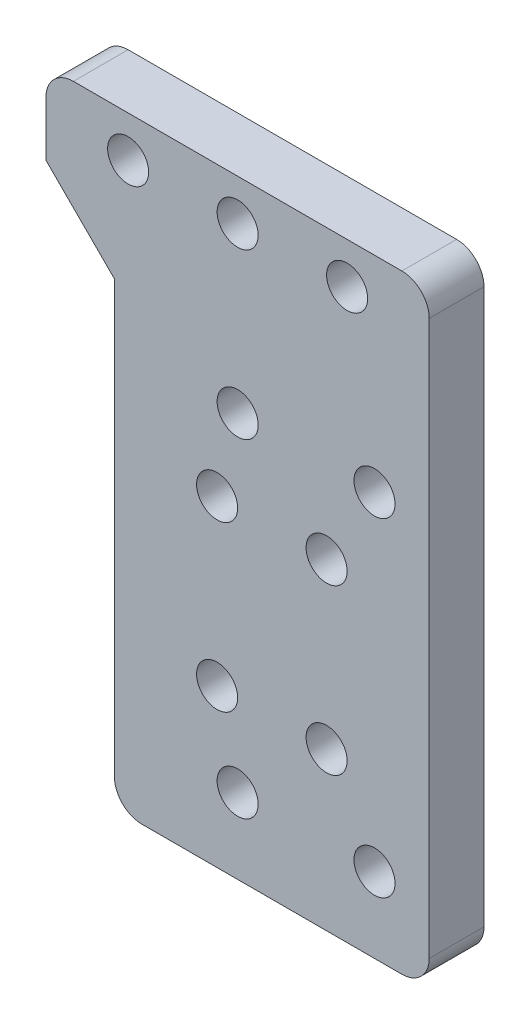
ISO-10303-21;
HEADER;
FILE_DESCRIPTION(('STEP AP214'),'2;1');
FILE_NAME('part.step','',(''),(''),'','','');
FILE_SCHEMA(('AUTOMOTIVE_DESIGN { 1 0 10303 214 1 1 1 1 }'));
ENDSEC;
DATA;
#1=APPLICATION_CONTEXT('core data for automotive mechanical design processes');
#2=APPLICATION_PROTOCOL_DEFINITION('international standard','automotive_design',2000,#1);
#3=PRODUCT_CONTEXT('',#1,'mechanical');
#4=PRODUCT('Part','Part','',(#3));
#5=PRODUCT_RELATED_PRODUCT_CATEGORY('part','',(#4));
#6=PRODUCT_DEFINITION_FORMATION('','',#4);
#7=PRODUCT_DEFINITION_CONTEXT('part definition',#1,'design');
#8=PRODUCT_DEFINITION('design','',#6,#7);
#9=PRODUCT_DEFINITION_SHAPE('','',#8);
#10=(LENGTH_UNIT() NAMED_UNIT(*) SI_UNIT(.MILLI.,.METRE.));
#11=(NAMED_UNIT(*) PLANE_ANGLE_UNIT() SI_UNIT($,.RADIAN.));
#12=(NAMED_UNIT(*) SI_UNIT($,.STERADIAN.) SOLID_ANGLE_UNIT());
#13=UNCERTAINTY_MEASURE_WITH_UNIT(LENGTH_MEASURE(1.E-05),#10,'distance_accuracy_value','');
#14=(GEOMETRIC_REPRESENTATION_CONTEXT(3) GLOBAL_UNCERTAINTY_ASSIGNED_CONTEXT((#13)) GLOBAL_UNIT_ASSIGNED_CONTEXT((#10,
#11,#12)) REPRESENTATION_CONTEXT('',''));
#15=CARTESIAN_POINT('',(0.,0.,0.));
#16=DIRECTION('',(0.,0.,1.));
#17=DIRECTION('',(1.,0.,0.));
#18=AXIS2_PLACEMENT_3D('',#15,#16,#17);
#19=CARTESIAN_POINT('',(0.,0.,4.));
#20=DIRECTION('',(0.,0.,-1.));
#21=DIRECTION('',(-1.,0.,0.));
#22=AXIS2_PLACEMENT_3D('',#19,#20,#21);
#23=PLANE('',#22);
#24=DIRECTION('',(0.,-1.,0.));
#25=VECTOR('',#24,1.);
#26=CARTESIAN_POINT('',(-9.00000000000005,11.2499999999999,4.));
#27=LINE('',#26,#25);
#28=CARTESIAN_POINT('',(-9.00000000000005,11.2499999999999,4.));
#29=VERTEX_POINT('',#28);
#30=CARTESIAN_POINT('',(-9.00000000000005,-20.25,4.));
#31=VERTEX_POINT('',#30);
#32=EDGE_CURVE('E138',#29,#31,#27,.T.);
#33=ORIENTED_EDGE('',*,*,#32,.T.);
#34=CARTESIAN_POINT('',(-7.00000000000005,-20.25,4.));
#35=DIRECTION('',(0.,0.,-1.));
#36=DIRECTION('',(-1.,0.,0.));
#37=AXIS2_PLACEMENT_3D('',#34,#35,#36);
#38=CIRCLE('',#37,2.);
#39=CARTESIAN_POINT('',(-7.00000000000005,-22.25,4.));
#40=VERTEX_POINT('',#39);
#41=EDGE_CURVE('E181',#31,#40,#38,.F.);
#42=ORIENTED_EDGE('',*,*,#41,.T.);
#43=DIRECTION('',(1.,0.,0.));
#44=VECTOR('',#43,1.);
#45=CARTESIAN_POINT('',(-9.00000000000005,-22.25,4.));
#46=LINE('',#45,#44);
#47=CARTESIAN_POINT('',(12.0000000000002,-22.25,4.));
#48=VERTEX_POINT('',#47);
#49=EDGE_CURVE('E143',#40,#48,#46,.T.);
#50=ORIENTED_EDGE('',*,*,#49,.T.);
#51=CARTESIAN_POINT('',(12.0000000000002,-20.25,4.));
#52=DIRECTION('',(0.,0.,-1.));
#53=DIRECTION('',(-1.,0.,0.));
#54=AXIS2_PLACEMENT_3D('',#51,#52,#53);
#55=CIRCLE('',#54,2.);
#56=CARTESIAN_POINT('',(14.0000000000002,-20.25,4.));
#57=VERTEX_POINT('',#56);
#58=EDGE_CURVE('E182',#48,#57,#55,.F.);
#59=ORIENTED_EDGE('',*,*,#58,.T.);
#60=DIRECTION('',(0.,1.,0.));
#61=VECTOR('',#60,1.);
#62=CARTESIAN_POINT('',(14.0000000000002,-22.25,4.));
#63=LINE('',#62,#61);
#64=CARTESIAN_POINT('',(14.0000000000002,20.25,4.));
#65=VERTEX_POINT('',#64);
#66=EDGE_CURVE('E165',#57,#65,#63,.T.);
#67=ORIENTED_EDGE('',*,*,#66,.T.);
#68=CARTESIAN_POINT('',(12.0000000000002,20.25,4.));
#69=DIRECTION('',(0.,0.,-1.));
#70=DIRECTION('',(-1.,0.,0.));
#71=AXIS2_PLACEMENT_3D('',#68,#69,#70);
#72=CIRCLE('',#71,2.);
#73=CARTESIAN_POINT('',(12.0000000000002,22.25,4.));
#74=VERTEX_POINT('',#73);
#75=EDGE_CURVE('E178',#65,#74,#72,.F.);
#76=ORIENTED_EDGE('',*,*,#75,.T.);
#77=DIRECTION('',(-1.,0.,0.));
#78=VECTOR('',#77,1.);
#79=CARTESIAN_POINT('',(-14.0000000000002,22.25,4.));
#80=LINE('',#79,#78);
#81=CARTESIAN_POINT('',(-12.0000000000002,22.25,4.));
#82=VERTEX_POINT('',#81);
#83=EDGE_CURVE('E123',#74,#82,#80,.T.);
#84=ORIENTED_EDGE('',*,*,#83,.T.);
#85=CARTESIAN_POINT('',(-12.0000000000002,20.25,4.));
#86=DIRECTION('',(0.,0.,-1.));
#87=DIRECTION('',(-1.,0.,0.));
#88=AXIS2_PLACEMENT_3D('',#85,#86,#87);
#89=CIRCLE('',#88,2.);
#90=CARTESIAN_POINT('',(-14.0000000000002,20.25,4.));
#91=VERTEX_POINT('',#90);
#92=EDGE_CURVE('E53',#82,#91,#89,.F.);
#93=ORIENTED_EDGE('',*,*,#92,.T.);
#94=DIRECTION('',(0.,-1.,0.));
#95=VECTOR('',#94,1.);
#96=CARTESIAN_POINT('',(-14.0000000000002,22.25,4.));
#97=LINE('',#96,#95);
#98=CARTESIAN_POINT('',(-14.0000000000002,16.25,4.));
#99=VERTEX_POINT('',#98);
#100=EDGE_CURVE('E113',#91,#99,#97,.T.);
#101=ORIENTED_EDGE('',*,*,#100,.T.);
#102=DIRECTION('',(0.707106781186554,-0.707106781186541,0.));
#103=VECTOR('',#102,1.);
#104=CARTESIAN_POINT('',(-14.0000000000002,16.25,4.));
#105=LINE('',#104,#103);
#106=EDGE_CURVE('E120',#99,#29,#105,.T.);
#107=ORIENTED_EDGE('',*,*,#106,.T.);
#108=EDGE_LOOP('',(#33,#42,#50,#59,#67,#76,#84,#93,#101,#107));
#109=FACE_BOUND('',#108,.T.);
#110=CARTESIAN_POINT('',(-1.4999999999998,1.25,4.));
#111=DIRECTION('',(0.,0.,1.));
#112=DIRECTION('',(1.,0.,0.));
#113=AXIS2_PLACEMENT_3D('',#110,#111,#112);
#114=CIRCLE('',#113,1.5);
#115=CARTESIAN_POINT('',(2.01878444516801E-13,1.25,4.));
#116=VERTEX_POINT('',#115);
#117=EDGE_CURVE('E151',#116,#116,#114,.T.);
#118=ORIENTED_EDGE('',*,*,#117,.F.);
#119=EDGE_LOOP('',(#118));
#120=FACE_BOUND('',#119,.T.);
#121=CARTESIAN_POINT('',(6.5000000000002,1.25,4.));
#122=DIRECTION('',(0.,0.,1.));
#123=DIRECTION('',(1.,0.,0.));
#124=AXIS2_PLACEMENT_3D('',#121,#122,#123);
#125=CIRCLE('',#124,1.5);
#126=CARTESIAN_POINT('',(8.0000000000002,1.25,4.));
#127=VERTEX_POINT('',#126);
#128=EDGE_CURVE('E259',#127,#127,#125,.T.);
#129=ORIENTED_EDGE('',*,*,#128,.F.);
#130=EDGE_LOOP('',(#129));
#131=FACE_BOUND('',#130,.T.);
#132=CARTESIAN_POINT('',(-1.49999999999967,-10.75,4.));
#133=DIRECTION('',(0.,0.,1.));
#134=DIRECTION('',(1.,0.,0.));
#135=AXIS2_PLACEMENT_3D('',#132,#133,#134);
#136=CIRCLE('',#135,1.5);
#137=CARTESIAN_POINT('',(3.26561694352634E-13,-10.75,4.));
#138=VERTEX_POINT('',#137);
#139=EDGE_CURVE('E264',#138,#138,#136,.T.);
#140=ORIENTED_EDGE('',*,*,#139,.F.);
#141=EDGE_LOOP('',(#140));
#142=FACE_BOUND('',#141,.T.);
#143=CARTESIAN_POINT('',(6.50000000000033,-10.75,4.));
#144=DIRECTION('',(0.,0.,1.));
#145=DIRECTION('',(1.,0.,0.));
#146=AXIS2_PLACEMENT_3D('',#143,#144,#145);
#147=CIRCLE('',#146,1.5);
#148=CARTESIAN_POINT('',(8.00000000000033,-10.75,4.));
#149=VERTEX_POINT('',#148);
#150=EDGE_CURVE('E271',#149,#149,#147,.T.);
#151=ORIENTED_EDGE('',*,*,#150,.F.);
#152=EDGE_LOOP('',(#151));
#153=FACE_BOUND('',#152,.T.);
#154=CARTESIAN_POINT('',(2.0122792321331E-13,7.25000000000003,4.));
#155=DIRECTION('',(0.,0.,1.));
#156=DIRECTION('',(1.,0.,0.));
#157=AXIS2_PLACEMENT_3D('',#154,#155,#156);
#158=CIRCLE('',#157,1.5);
#159=CARTESIAN_POINT('',(1.5000000000002,7.25000000000003,4.));
#160=VERTEX_POINT('',#159);
#161=EDGE_CURVE('E280',#160,#160,#158,.T.);
#162=ORIENTED_EDGE('',*,*,#161,.F.);
#163=EDGE_LOOP('',(#162));
#164=FACE_BOUND('',#163,.T.);
#165=CARTESIAN_POINT('',(10.0000000000002,7.24999999999992,4.));
#166=DIRECTION('',(0.,0.,1.));
#167=DIRECTION('',(1.,0.,0.));
#168=AXIS2_PLACEMENT_3D('',#165,#166,#167);
#169=CIRCLE('',#168,1.5);
#170=CARTESIAN_POINT('',(11.5000000000002,7.24999999999992,4.));
#171=VERTEX_POINT('',#170);
#172=EDGE_CURVE('E284',#171,#171,#169,.T.);
#173=ORIENTED_EDGE('',*,*,#172,.F.);
#174=EDGE_LOOP('',(#173));
#175=FACE_BOUND('',#174,.T.);
#176=CARTESIAN_POINT('',(2.02962646689286E-13,-16.75,4.));
#177=DIRECTION('',(0.,0.,1.));
#178=DIRECTION('',(1.,0.,0.));
#179=AXIS2_PLACEMENT_3D('',#176,#177,#178);
#180=CIRCLE('',#179,1.5);
#181=CARTESIAN_POINT('',(1.5000000000002,-16.75,4.));
#182=VERTEX_POINT('',#181);
#183=EDGE_CURVE('E288',#182,#182,#180,.T.);
#184=ORIENTED_EDGE('',*,*,#183,.F.);
#185=EDGE_LOOP('',(#184));
#186=FACE_BOUND('',#185,.T.);
#187=CARTESIAN_POINT('',(10.0000000000002,-16.7500000000001,4.));
#188=DIRECTION('',(0.,0.,1.));
#189=DIRECTION('',(1.,0.,0.));
#190=AXIS2_PLACEMENT_3D('',#187,#188,#189);
#191=CIRCLE('',#190,1.5);
#192=CARTESIAN_POINT('',(11.5000000000002,-16.7500000000001,4.));
#193=VERTEX_POINT('',#192);
#194=EDGE_CURVE('E293',#193,#193,#191,.T.);
#195=ORIENTED_EDGE('',*,*,#194,.F.);
#196=EDGE_LOOP('',(#195));
#197=FACE_BOUND('',#196,.T.);
#198=CARTESIAN_POINT('',(8.0000000000002,19.25,4.));
#199=DIRECTION('',(0.,0.,1.));
#200=DIRECTION('',(1.,0.,0.));
#201=AXIS2_PLACEMENT_3D('',#198,#199,#200);
#202=CIRCLE('',#201,1.5);
#203=CARTESIAN_POINT('',(9.5000000000002,19.25,4.));
#204=VERTEX_POINT('',#203);
#205=EDGE_CURVE('E301',#204,#204,#202,.T.);
#206=ORIENTED_EDGE('',*,*,#205,.F.);
#207=EDGE_LOOP('',(#206));
#208=FACE_BOUND('',#207,.T.);
#209=CARTESIAN_POINT('',(1.99493199737333E-13,19.2499999999999,4.));
#210=DIRECTION('',(0.,0.,1.));
#211=DIRECTION('',(1.,0.,0.));
#212=AXIS2_PLACEMENT_3D('',#209,#210,#211);
#213=CIRCLE('',#212,1.5);
#214=CARTESIAN_POINT('',(1.5000000000002,19.2499999999999,4.));
#215=VERTEX_POINT('',#214);
#216=EDGE_CURVE('E307',#215,#215,#213,.T.);
#217=ORIENTED_EDGE('',*,*,#216,.F.);
#218=EDGE_LOOP('',(#217));
#219=FACE_BOUND('',#218,.T.);
#220=CARTESIAN_POINT('',(-7.9999999999998,19.2499999999999,4.));
#221=DIRECTION('',(0.,0.,1.));
#222=DIRECTION('',(1.,0.,0.));
#223=AXIS2_PLACEMENT_3D('',#220,#221,#222);
#224=CIRCLE('',#223,1.5);
#225=CARTESIAN_POINT('',(-6.4999999999998,19.2499999999999,4.));
#226=VERTEX_POINT('',#225);
#227=EDGE_CURVE('E311',#226,#226,#224,.T.);
#228=ORIENTED_EDGE('',*,*,#227,.F.);
#229=EDGE_LOOP('',(#228));
#230=FACE_BOUND('',#229,.T.);
#231=ADVANCED_FACE('F39',(#109,#120,#131,#142,#153,#164,#175,#186,#197,#208,#219,#230),#23,.F.);
#232=CARTESIAN_POINT('',(0.,0.,0.));
#233=DIRECTION('',(0.,0.,-1.));
#234=DIRECTION('',(-1.,0.,0.));
#235=AXIS2_PLACEMENT_3D('',#232,#233,#234);
#236=PLANE('',#235);
#237=CARTESIAN_POINT('',(1.99493199737333E-13,19.2499999999999,0.));
#238=DIRECTION('',(0.,0.,1.));
#239=DIRECTION('',(1.,0.,0.));
#240=AXIS2_PLACEMENT_3D('',#237,#238,#239);
#241=CIRCLE('',#240,1.5);
#242=CARTESIAN_POINT('',(1.5000000000002,19.2499999999999,0.));
#243=VERTEX_POINT('',#242);
#244=EDGE_CURVE('E309',#243,#243,#241,.T.);
#245=ORIENTED_EDGE('',*,*,#244,.T.);
#246=EDGE_LOOP('',(#245));
#247=FACE_BOUND('',#246,.T.);
#248=CARTESIAN_POINT('',(10.0000000000002,-16.7500000000001,0.));
#249=DIRECTION('',(0.,0.,1.));
#250=DIRECTION('',(1.,0.,0.));
#251=AXIS2_PLACEMENT_3D('',#248,#249,#250);
#252=CIRCLE('',#251,1.5);
#253=CARTESIAN_POINT('',(11.5000000000002,-16.7500000000001,0.));
#254=VERTEX_POINT('',#253);
#255=EDGE_CURVE('E299',#254,#254,#252,.T.);
#256=ORIENTED_EDGE('',*,*,#255,.T.);
#257=EDGE_LOOP('',(#256));
#258=FACE_BOUND('',#257,.T.);
#259=CARTESIAN_POINT('',(10.0000000000002,7.24999999999992,0.));
#260=DIRECTION('',(0.,0.,1.));
#261=DIRECTION('',(1.,0.,0.));
#262=AXIS2_PLACEMENT_3D('',#259,#260,#261);
#263=CIRCLE('',#262,1.5);
#264=CARTESIAN_POINT('',(11.5000000000002,7.24999999999992,0.));
#265=VERTEX_POINT('',#264);
#266=EDGE_CURVE('E286',#265,#265,#263,.T.);
#267=ORIENTED_EDGE('',*,*,#266,.T.);
#268=EDGE_LOOP('',(#267));
#269=FACE_BOUND('',#268,.T.);
#270=CARTESIAN_POINT('',(6.50000000000033,-10.75,0.));
#271=DIRECTION('',(0.,0.,1.));
#272=DIRECTION('',(1.,0.,0.));
#273=AXIS2_PLACEMENT_3D('',#270,#271,#272);
#274=CIRCLE('',#273,1.5);
#275=CARTESIAN_POINT('',(8.00000000000033,-10.75,0.));
#276=VERTEX_POINT('',#275);
#277=EDGE_CURVE('E273',#276,#276,#274,.T.);
#278=ORIENTED_EDGE('',*,*,#277,.T.);
#279=EDGE_LOOP('',(#278));
#280=FACE_BOUND('',#279,.T.);
#281=CARTESIAN_POINT('',(6.5000000000002,1.25,0.));
#282=DIRECTION('',(0.,0.,1.));
#283=DIRECTION('',(1.,0.,0.));
#284=AXIS2_PLACEMENT_3D('',#281,#282,#283);
#285=CIRCLE('',#284,1.5);
#286=CARTESIAN_POINT('',(8.0000000000002,1.25,0.));
#287=VERTEX_POINT('',#286);
#288=EDGE_CURVE('E265',#287,#287,#285,.T.);
#289=ORIENTED_EDGE('',*,*,#288,.T.);
#290=EDGE_LOOP('',(#289));
#291=FACE_BOUND('',#290,.T.);
#292=DIRECTION('',(1.,0.,0.));
#293=VECTOR('',#292,1.);
#294=CARTESIAN_POINT('',(-9.00000000000005,-22.25,0.));
#295=LINE('',#294,#293);
#296=CARTESIAN_POINT('',(-7.00000000000005,-22.25,0.));
#297=VERTEX_POINT('',#296);
#298=CARTESIAN_POINT('',(12.0000000000002,-22.25,0.));
#299=VERTEX_POINT('',#298);
#300=EDGE_CURVE('E157',#297,#299,#295,.T.);
#301=ORIENTED_EDGE('',*,*,#300,.F.);
#302=CARTESIAN_POINT('',(-7.00000000000005,-20.25,0.));
#303=DIRECTION('',(0.,0.,-1.));
#304=DIRECTION('',(-1.,0.,0.));
#305=AXIS2_PLACEMENT_3D('',#302,#303,#304);
#306=CIRCLE('',#305,2.);
#307=CARTESIAN_POINT('',(-9.00000000000005,-20.25,0.));
#308=VERTEX_POINT('',#307);
#309=EDGE_CURVE('E173',#297,#308,#306,.T.);
#310=ORIENTED_EDGE('',*,*,#309,.T.);
#311=DIRECTION('',(0.,-1.,0.));
#312=VECTOR('',#311,1.);
#313=CARTESIAN_POINT('',(-9.00000000000005,11.2499999999999,0.));
#314=LINE('',#313,#312);
#315=CARTESIAN_POINT('',(-9.00000000000005,11.2499999999999,0.));
#316=VERTEX_POINT('',#315);
#317=EDGE_CURVE('E156',#316,#308,#314,.T.);
#318=ORIENTED_EDGE('',*,*,#317,.F.);
#319=DIRECTION('',(0.707106781186554,-0.707106781186541,0.));
#320=VECTOR('',#319,1.);
#321=CARTESIAN_POINT('',(-14.0000000000002,16.25,0.));
#322=LINE('',#321,#320);
#323=CARTESIAN_POINT('',(-14.0000000000002,16.25,0.));
#324=VERTEX_POINT('',#323);
#325=EDGE_CURVE('E152',#324,#316,#322,.T.);
#326=ORIENTED_EDGE('',*,*,#325,.F.);
#327=DIRECTION('',(0.,-1.,0.));
#328=VECTOR('',#327,1.);
#329=CARTESIAN_POINT('',(-14.0000000000002,22.25,0.));
#330=LINE('',#329,#328);
#331=CARTESIAN_POINT('',(-14.0000000000002,20.25,0.));
#332=VERTEX_POINT('',#331);
#333=EDGE_CURVE('E128',#332,#324,#330,.T.);
#334=ORIENTED_EDGE('',*,*,#333,.F.);
#335=CARTESIAN_POINT('',(-12.0000000000002,20.25,0.));
#336=DIRECTION('',(0.,0.,-1.));
#337=DIRECTION('',(-1.,0.,0.));
#338=AXIS2_PLACEMENT_3D('',#335,#336,#337);
#339=CIRCLE('',#338,2.);
#340=CARTESIAN_POINT('',(-12.0000000000002,22.25,0.));
#341=VERTEX_POINT('',#340);
#342=EDGE_CURVE('E169',#332,#341,#339,.T.);
#343=ORIENTED_EDGE('',*,*,#342,.T.);
#344=DIRECTION('',(-1.,0.,0.));
#345=VECTOR('',#344,1.);
#346=CARTESIAN_POINT('',(-14.0000000000002,22.25,0.));
#347=LINE('',#346,#345);
#348=CARTESIAN_POINT('',(12.0000000000002,22.25,0.));
#349=VERTEX_POINT('',#348);
#350=EDGE_CURVE('E147',#349,#341,#347,.T.);
#351=ORIENTED_EDGE('',*,*,#350,.F.);
#352=CARTESIAN_POINT('',(12.0000000000002,20.25,0.));
#353=DIRECTION('',(0.,0.,-1.));
#354=DIRECTION('',(-1.,0.,0.));
#355=AXIS2_PLACEMENT_3D('',#352,#353,#354);
#356=CIRCLE('',#355,2.);
#357=CARTESIAN_POINT('',(14.0000000000002,20.25,0.));
#358=VERTEX_POINT('',#357);
#359=EDGE_CURVE('E168',#349,#358,#356,.T.);
#360=ORIENTED_EDGE('',*,*,#359,.T.);
#361=DIRECTION('',(0.,1.,0.));
#362=VECTOR('',#361,1.);
#363=CARTESIAN_POINT('',(14.0000000000002,-22.25,0.));
#364=LINE('',#363,#362);
#365=CARTESIAN_POINT('',(14.0000000000002,-20.25,0.));
#366=VERTEX_POINT('',#365);
#367=EDGE_CURVE('E150',#366,#358,#364,.T.);
#368=ORIENTED_EDGE('',*,*,#367,.F.);
#369=CARTESIAN_POINT('',(12.0000000000002,-20.25,0.));
#370=DIRECTION('',(0.,0.,-1.));
#371=DIRECTION('',(-1.,0.,0.));
#372=AXIS2_PLACEMENT_3D('',#369,#370,#371);
#373=CIRCLE('',#372,2.);
#374=EDGE_CURVE('E172',#366,#299,#373,.T.);
#375=ORIENTED_EDGE('',*,*,#374,.T.);
#376=EDGE_LOOP('',(#301,#310,#318,#326,#334,#343,#351,#360,#368,#375));
#377=FACE_BOUND('',#376,.T.);
#378=CARTESIAN_POINT('',(-1.4999999999998,1.25,0.));
#379=DIRECTION('',(0.,0.,1.));
#380=DIRECTION('',(1.,0.,0.));
#381=AXIS2_PLACEMENT_3D('',#378,#379,#380);
#382=CIRCLE('',#381,1.5);
#383=CARTESIAN_POINT('',(2.01878444516801E-13,1.25,0.));
#384=VERTEX_POINT('',#383);
#385=EDGE_CURVE('E258',#384,#384,#382,.T.);
#386=ORIENTED_EDGE('',*,*,#385,.T.);
#387=EDGE_LOOP('',(#386));
#388=FACE_BOUND('',#387,.T.);
#389=CARTESIAN_POINT('',(-1.49999999999967,-10.75,0.));
#390=DIRECTION('',(0.,0.,1.));
#391=DIRECTION('',(1.,0.,0.));
#392=AXIS2_PLACEMENT_3D('',#389,#390,#391);
#393=CIRCLE('',#392,1.5);
#394=CARTESIAN_POINT('',(3.26561694352634E-13,-10.75,0.));
#395=VERTEX_POINT('',#394);
#396=EDGE_CURVE('E268',#395,#395,#393,.T.);
#397=ORIENTED_EDGE('',*,*,#396,.T.);
#398=EDGE_LOOP('',(#397));
#399=FACE_BOUND('',#398,.T.);
#400=CARTESIAN_POINT('',(2.0122792321331E-13,7.25000000000003,0.));
#401=DIRECTION('',(0.,0.,1.));
#402=DIRECTION('',(1.,0.,0.));
#403=AXIS2_PLACEMENT_3D('',#400,#401,#402);
#404=CIRCLE('',#403,1.5);
#405=CARTESIAN_POINT('',(1.5000000000002,7.25000000000003,0.));
#406=VERTEX_POINT('',#405);
#407=EDGE_CURVE('E278',#406,#406,#404,.T.);
#408=ORIENTED_EDGE('',*,*,#407,.T.);
#409=EDGE_LOOP('',(#408));
#410=FACE_BOUND('',#409,.T.);
#411=CARTESIAN_POINT('',(2.02962646689286E-13,-16.75,0.));
#412=DIRECTION('',(0.,0.,1.));
#413=DIRECTION('',(1.,0.,0.));
#414=AXIS2_PLACEMENT_3D('',#411,#412,#413);
#415=CIRCLE('',#414,1.5);
#416=CARTESIAN_POINT('',(1.5000000000002,-16.75,0.));
#417=VERTEX_POINT('',#416);
#418=EDGE_CURVE('E295',#417,#417,#415,.T.);
#419=ORIENTED_EDGE('',*,*,#418,.T.);
#420=EDGE_LOOP('',(#419));
#421=FACE_BOUND('',#420,.T.);
#422=CARTESIAN_POINT('',(8.0000000000002,19.25,0.));
#423=DIRECTION('',(0.,0.,1.));
#424=DIRECTION('',(1.,0.,0.));
#425=AXIS2_PLACEMENT_3D('',#422,#423,#424);
#426=CIRCLE('',#425,1.5);
#427=CARTESIAN_POINT('',(9.5000000000002,19.25,0.));
#428=VERTEX_POINT('',#427);
#429=EDGE_CURVE('E303',#428,#428,#426,.T.);
#430=ORIENTED_EDGE('',*,*,#429,.T.);
#431=EDGE_LOOP('',(#430));
#432=FACE_BOUND('',#431,.T.);
#433=CARTESIAN_POINT('',(-7.9999999999998,19.2499999999999,0.));
#434=DIRECTION('',(0.,0.,1.));
#435=DIRECTION('',(1.,0.,0.));
#436=AXIS2_PLACEMENT_3D('',#433,#434,#435);
#437=CIRCLE('',#436,1.5);
#438=CARTESIAN_POINT('',(-6.4999999999998,19.2499999999999,0.));
#439=VERTEX_POINT('',#438);
#440=EDGE_CURVE('E316',#439,#439,#437,.T.);
#441=ORIENTED_EDGE('',*,*,#440,.T.);
#442=EDGE_LOOP('',(#441));
#443=FACE_BOUND('',#442,.T.);
#444=ADVANCED_FACE('F196',(#247,#258,#269,#280,#291,#377,#388,#399,#410,#421,#432,#443),#236,.T.);
#445=CARTESIAN_POINT('',(14.0000000000002,-22.25,4.));
#446=DIRECTION('',(-1.,0.,0.));
#447=DIRECTION('',(0.,-1.,0.));
#448=AXIS2_PLACEMENT_3D('',#445,#446,#447);
#449=PLANE('',#448);
#450=ORIENTED_EDGE('',*,*,#66,.F.);
#451=DIRECTION('',(0.,0.,-1.));
#452=VECTOR('',#451,1.);
#453=CARTESIAN_POINT('',(14.0000000000002,-20.25,4.));
#454=LINE('',#453,#452);
#455=EDGE_CURVE('E187',#57,#366,#454,.T.);
#456=ORIENTED_EDGE('',*,*,#455,.T.);
#457=ORIENTED_EDGE('',*,*,#367,.T.);
#458=DIRECTION('',(0.,0.,-1.));
#459=VECTOR('',#458,1.);
#460=CARTESIAN_POINT('',(14.0000000000002,20.25,4.));
#461=LINE('',#460,#459);
#462=EDGE_CURVE('E183',#358,#65,#461,.F.);
#463=ORIENTED_EDGE('',*,*,#462,.T.);
#464=EDGE_LOOP('',(#450,#456,#457,#463));
#465=FACE_BOUND('',#464,.T.);
#466=ADVANCED_FACE('F212',(#465),#449,.F.);
#467=CARTESIAN_POINT('',(-14.0000000000002,22.25,4.));
#468=DIRECTION('',(0.,-1.,0.));
#469=DIRECTION('',(0.,0.,-1.));
#470=AXIS2_PLACEMENT_3D('',#467,#468,#469);
#471=PLANE('',#470);
#472=ORIENTED_EDGE('',*,*,#83,.F.);
#473=DIRECTION('',(0.,0.,-1.));
#474=VECTOR('',#473,1.);
#475=CARTESIAN_POINT('',(12.0000000000002,22.25,4.));
#476=LINE('',#475,#474);
#477=EDGE_CURVE('E50',#74,#349,#476,.T.);
#478=ORIENTED_EDGE('',*,*,#477,.T.);
#479=ORIENTED_EDGE('',*,*,#350,.T.);
#480=DIRECTION('',(0.,0.,-1.));
#481=VECTOR('',#480,1.);
#482=CARTESIAN_POINT('',(-12.0000000000002,22.25,4.));
#483=LINE('',#482,#481);
#484=EDGE_CURVE('E62',#341,#82,#483,.F.);
#485=ORIENTED_EDGE('',*,*,#484,.T.);
#486=EDGE_LOOP('',(#472,#478,#479,#485));
#487=FACE_BOUND('',#486,.T.);
#488=ADVANCED_FACE('F192',(#487),#471,.F.);
#489=CARTESIAN_POINT('',(-14.0000000000002,22.25,4.));
#490=DIRECTION('',(1.,0.,0.));
#491=DIRECTION('',(0.,1.,0.));
#492=AXIS2_PLACEMENT_3D('',#489,#490,#491);
#493=PLANE('',#492);
#494=ORIENTED_EDGE('',*,*,#100,.F.);
#495=DIRECTION('',(0.,0.,-1.));
#496=VECTOR('',#495,1.);
#497=CARTESIAN_POINT('',(-14.0000000000002,20.25,4.));
#498=LINE('',#497,#496);
#499=EDGE_CURVE('E11',#91,#332,#498,.T.);
#500=ORIENTED_EDGE('',*,*,#499,.T.);
#501=ORIENTED_EDGE('',*,*,#333,.T.);
#502=DIRECTION('',(0.,0.,-1.));
#503=VECTOR('',#502,1.);
#504=CARTESIAN_POINT('',(-14.0000000000002,16.25,4.));
#505=LINE('',#504,#503);
#506=EDGE_CURVE('E130',#99,#324,#505,.T.);
#507=ORIENTED_EDGE('',*,*,#506,.F.);
#508=EDGE_LOOP('',(#494,#500,#501,#507));
#509=FACE_BOUND('',#508,.T.);
#510=ADVANCED_FACE('F126',(#509),#493,.F.);
#511=CARTESIAN_POINT('',(-14.0000000000002,16.25,4.));
#512=DIRECTION('',(0.707106781186541,0.707106781186554,0.));
#513=DIRECTION('',(-0.707106781186554,0.707106781186541,0.));
#514=AXIS2_PLACEMENT_3D('',#511,#512,#513);
#515=PLANE('',#514);
#516=ORIENTED_EDGE('',*,*,#325,.T.);
#517=DIRECTION('',(0.,0.,-1.));
#518=VECTOR('',#517,1.);
#519=CARTESIAN_POINT('',(-9.00000000000005,11.2499999999999,4.));
#520=LINE('',#519,#518);
#521=EDGE_CURVE('E133',#29,#316,#520,.T.);
#522=ORIENTED_EDGE('',*,*,#521,.F.);
#523=ORIENTED_EDGE('',*,*,#106,.F.);
#524=ORIENTED_EDGE('',*,*,#506,.T.);
#525=EDGE_LOOP('',(#516,#522,#523,#524));
#526=FACE_BOUND('',#525,.T.);
#527=ADVANCED_FACE('F136',(#526),#515,.F.);
#528=CARTESIAN_POINT('',(-9.00000000000005,11.2499999999999,4.));
#529=DIRECTION('',(1.,0.,0.));
#530=DIRECTION('',(0.,1.,0.));
#531=AXIS2_PLACEMENT_3D('',#528,#529,#530);
#532=PLANE('',#531);
#533=ORIENTED_EDGE('',*,*,#317,.T.);
#534=DIRECTION('',(0.,0.,-1.));
#535=VECTOR('',#534,1.);
#536=CARTESIAN_POINT('',(-9.00000000000005,-20.25,4.));
#537=LINE('',#536,#535);
#538=EDGE_CURVE('E176',#308,#31,#537,.F.);
#539=ORIENTED_EDGE('',*,*,#538,.T.);
#540=ORIENTED_EDGE('',*,*,#32,.F.);
#541=ORIENTED_EDGE('',*,*,#521,.T.);
#542=EDGE_LOOP('',(#533,#539,#540,#541));
#543=FACE_BOUND('',#542,.T.);
#544=ADVANCED_FACE('F221',(#543),#532,.F.);
#545=CARTESIAN_POINT('',(-9.00000000000005,-22.25,4.));
#546=DIRECTION('',(0.,1.,0.));
#547=DIRECTION('',(0.,0.,1.));
#548=AXIS2_PLACEMENT_3D('',#545,#546,#547);
#549=PLANE('',#548);
#550=ORIENTED_EDGE('',*,*,#49,.F.);
#551=DIRECTION('',(0.,0.,-1.));
#552=VECTOR('',#551,1.);
#553=CARTESIAN_POINT('',(-7.00000000000005,-22.25,4.));
#554=LINE('',#553,#552);
#555=EDGE_CURVE('E164',#40,#297,#554,.T.);
#556=ORIENTED_EDGE('',*,*,#555,.T.);
#557=ORIENTED_EDGE('',*,*,#300,.T.);
#558=DIRECTION('',(0.,0.,-1.));
#559=VECTOR('',#558,1.);
#560=CARTESIAN_POINT('',(12.0000000000002,-22.25,4.));
#561=LINE('',#560,#559);
#562=EDGE_CURVE('E134',#299,#48,#561,.F.);
#563=ORIENTED_EDGE('',*,*,#562,.T.);
#564=EDGE_LOOP('',(#550,#556,#557,#563));
#565=FACE_BOUND('',#564,.T.);
#566=ADVANCED_FACE('F222',(#565),#549,.F.);
#567=CARTESIAN_POINT('',(-1.4999999999998,1.25,4.));
#568=DIRECTION('',(0.,0.,-1.));
#569=DIRECTION('',(-1.,0.,0.));
#570=AXIS2_PLACEMENT_3D('',#567,#568,#569);
#571=CYLINDRICAL_SURFACE('',#570,1.5);
#572=ORIENTED_EDGE('',*,*,#117,.T.);
#573=EDGE_LOOP('',(#572));
#574=FACE_BOUND('',#573,.T.);
#575=ORIENTED_EDGE('',*,*,#385,.F.);
#576=EDGE_LOOP('',(#575));
#577=FACE_BOUND('',#576,.T.);
#578=ADVANCED_FACE('F217',(#574,#577),#571,.F.);
#579=CARTESIAN_POINT('',(6.5000000000002,1.25,4.));
#580=DIRECTION('',(0.,0.,-1.));
#581=DIRECTION('',(-1.,0.,0.));
#582=AXIS2_PLACEMENT_3D('',#579,#580,#581);
#583=CYLINDRICAL_SURFACE('',#582,1.5);
#584=ORIENTED_EDGE('',*,*,#128,.T.);
#585=EDGE_LOOP('',(#584));
#586=FACE_BOUND('',#585,.T.);
#587=ORIENTED_EDGE('',*,*,#288,.F.);
#588=EDGE_LOOP('',(#587));
#589=FACE_BOUND('',#588,.T.);
#590=ADVANCED_FACE('F359',(#586,#589),#583,.F.);
#591=CARTESIAN_POINT('',(-1.49999999999967,-10.75,4.));
#592=DIRECTION('',(0.,0.,-1.));
#593=DIRECTION('',(-1.,0.,0.));
#594=AXIS2_PLACEMENT_3D('',#591,#592,#593);
#595=CYLINDRICAL_SURFACE('',#594,1.5);
#596=ORIENTED_EDGE('',*,*,#139,.T.);
#597=EDGE_LOOP('',(#596));
#598=FACE_BOUND('',#597,.T.);
#599=ORIENTED_EDGE('',*,*,#396,.F.);
#600=EDGE_LOOP('',(#599));
#601=FACE_BOUND('',#600,.T.);
#602=ADVANCED_FACE('F360',(#598,#601),#595,.F.);
#603=CARTESIAN_POINT('',(6.50000000000033,-10.75,4.));
#604=DIRECTION('',(0.,0.,-1.));
#605=DIRECTION('',(-1.,0.,0.));
#606=AXIS2_PLACEMENT_3D('',#603,#604,#605);
#607=CYLINDRICAL_SURFACE('',#606,1.5);
#608=ORIENTED_EDGE('',*,*,#150,.T.);
#609=EDGE_LOOP('',(#608));
#610=FACE_BOUND('',#609,.T.);
#611=ORIENTED_EDGE('',*,*,#277,.F.);
#612=EDGE_LOOP('',(#611));
#613=FACE_BOUND('',#612,.T.);
#614=ADVANCED_FACE('F354',(#610,#613),#607,.F.);
#615=CARTESIAN_POINT('',(2.0122792321331E-13,7.25000000000003,4.));
#616=DIRECTION('',(0.,0.,-1.));
#617=DIRECTION('',(-1.,0.,0.));
#618=AXIS2_PLACEMENT_3D('',#615,#616,#617);
#619=CYLINDRICAL_SURFACE('',#618,1.5);
#620=ORIENTED_EDGE('',*,*,#161,.T.);
#621=EDGE_LOOP('',(#620));
#622=FACE_BOUND('',#621,.T.);
#623=ORIENTED_EDGE('',*,*,#407,.F.);
#624=EDGE_LOOP('',(#623));
#625=FACE_BOUND('',#624,.T.);
#626=ADVANCED_FACE('F349',(#622,#625),#619,.F.);
#627=CARTESIAN_POINT('',(10.0000000000002,7.24999999999992,4.));
#628=DIRECTION('',(0.,0.,-1.));
#629=DIRECTION('',(-1.,0.,0.));
#630=AXIS2_PLACEMENT_3D('',#627,#628,#629);
#631=CYLINDRICAL_SURFACE('',#630,1.5);
#632=ORIENTED_EDGE('',*,*,#172,.T.);
#633=EDGE_LOOP('',(#632));
#634=FACE_BOUND('',#633,.T.);
#635=ORIENTED_EDGE('',*,*,#266,.F.);
#636=EDGE_LOOP('',(#635));
#637=FACE_BOUND('',#636,.T.);
#638=ADVANCED_FACE('F344',(#634,#637),#631,.F.);
#639=CARTESIAN_POINT('',(2.02962646689286E-13,-16.75,4.));
#640=DIRECTION('',(0.,0.,-1.));
#641=DIRECTION('',(-1.,0.,0.));
#642=AXIS2_PLACEMENT_3D('',#639,#640,#641);
#643=CYLINDRICAL_SURFACE('',#642,1.5);
#644=ORIENTED_EDGE('',*,*,#183,.T.);
#645=EDGE_LOOP('',(#644));
#646=FACE_BOUND('',#645,.T.);
#647=ORIENTED_EDGE('',*,*,#418,.F.);
#648=EDGE_LOOP('',(#647));
#649=FACE_BOUND('',#648,.T.);
#650=ADVANCED_FACE('F341',(#646,#649),#643,.F.);
#651=CARTESIAN_POINT('',(10.0000000000002,-16.7500000000001,4.));
#652=DIRECTION('',(0.,0.,-1.));
#653=DIRECTION('',(-1.,0.,0.));
#654=AXIS2_PLACEMENT_3D('',#651,#652,#653);
#655=CYLINDRICAL_SURFACE('',#654,1.5);
#656=ORIENTED_EDGE('',*,*,#194,.T.);
#657=EDGE_LOOP('',(#656));
#658=FACE_BOUND('',#657,.T.);
#659=ORIENTED_EDGE('',*,*,#255,.F.);
#660=EDGE_LOOP('',(#659));
#661=FACE_BOUND('',#660,.T.);
#662=ADVANCED_FACE('F337',(#658,#661),#655,.F.);
#663=CARTESIAN_POINT('',(8.0000000000002,19.25,4.));
#664=DIRECTION('',(0.,0.,-1.));
#665=DIRECTION('',(-1.,0.,0.));
#666=AXIS2_PLACEMENT_3D('',#663,#664,#665);
#667=CYLINDRICAL_SURFACE('',#666,1.5);
#668=ORIENTED_EDGE('',*,*,#205,.T.);
#669=EDGE_LOOP('',(#668));
#670=FACE_BOUND('',#669,.T.);
#671=ORIENTED_EDGE('',*,*,#429,.F.);
#672=EDGE_LOOP('',(#671));
#673=FACE_BOUND('',#672,.T.);
#674=ADVANCED_FACE('F332',(#670,#673),#667,.F.);
#675=CARTESIAN_POINT('',(1.99493199737333E-13,19.2499999999999,4.));
#676=DIRECTION('',(0.,0.,-1.));
#677=DIRECTION('',(-1.,0.,0.));
#678=AXIS2_PLACEMENT_3D('',#675,#676,#677);
#679=CYLINDRICAL_SURFACE('',#678,1.5);
#680=ORIENTED_EDGE('',*,*,#216,.T.);
#681=EDGE_LOOP('',(#680));
#682=FACE_BOUND('',#681,.T.);
#683=ORIENTED_EDGE('',*,*,#244,.F.);
#684=EDGE_LOOP('',(#683));
#685=FACE_BOUND('',#684,.T.);
#686=ADVANCED_FACE('F322',(#682,#685),#679,.F.);
#687=CARTESIAN_POINT('',(-7.9999999999998,19.2499999999999,4.));
#688=DIRECTION('',(0.,0.,-1.));
#689=DIRECTION('',(-1.,0.,0.));
#690=AXIS2_PLACEMENT_3D('',#687,#688,#689);
#691=CYLINDRICAL_SURFACE('',#690,1.5);
#692=ORIENTED_EDGE('',*,*,#227,.T.);
#693=EDGE_LOOP('',(#692));
#694=FACE_BOUND('',#693,.T.);
#695=ORIENTED_EDGE('',*,*,#440,.F.);
#696=EDGE_LOOP('',(#695));
#697=FACE_BOUND('',#696,.T.);
#698=ADVANCED_FACE('F241',(#694,#697),#691,.F.);
#699=CARTESIAN_POINT('',(-7.00000000000005,-20.25,4.));
#700=DIRECTION('',(0.,0.,-1.));
#701=DIRECTION('',(-1.,0.,0.));
#702=AXIS2_PLACEMENT_3D('',#699,#700,#701);
#703=CYLINDRICAL_SURFACE('',#702,2.);
#704=ORIENTED_EDGE('',*,*,#41,.F.);
#705=ORIENTED_EDGE('',*,*,#538,.F.);
#706=ORIENTED_EDGE('',*,*,#309,.F.);
#707=ORIENTED_EDGE('',*,*,#555,.F.);
#708=EDGE_LOOP('',(#704,#705,#706,#707));
#709=FACE_BOUND('',#708,.T.);
#710=ADVANCED_FACE('F236',(#709),#703,.T.);
#711=CARTESIAN_POINT('',(12.0000000000002,-20.25,4.));
#712=DIRECTION('',(0.,0.,-1.));
#713=DIRECTION('',(-1.,0.,0.));
#714=AXIS2_PLACEMENT_3D('',#711,#712,#713);
#715=CYLINDRICAL_SURFACE('',#714,2.);
#716=ORIENTED_EDGE('',*,*,#58,.F.);
#717=ORIENTED_EDGE('',*,*,#562,.F.);
#718=ORIENTED_EDGE('',*,*,#374,.F.);
#719=ORIENTED_EDGE('',*,*,#455,.F.);
#720=EDGE_LOOP('',(#716,#717,#718,#719));
#721=FACE_BOUND('',#720,.T.);
#722=ADVANCED_FACE('F210',(#721),#715,.T.);
#723=CARTESIAN_POINT('',(12.0000000000002,20.25,4.));
#724=DIRECTION('',(0.,0.,-1.));
#725=DIRECTION('',(-1.,0.,0.));
#726=AXIS2_PLACEMENT_3D('',#723,#724,#725);
#727=CYLINDRICAL_SURFACE('',#726,2.);
#728=ORIENTED_EDGE('',*,*,#75,.F.);
#729=ORIENTED_EDGE('',*,*,#462,.F.);
#730=ORIENTED_EDGE('',*,*,#359,.F.);
#731=ORIENTED_EDGE('',*,*,#477,.F.);
#732=EDGE_LOOP('',(#728,#729,#730,#731));
#733=FACE_BOUND('',#732,.T.);
#734=ADVANCED_FACE('F201',(#733),#727,.T.);
#735=CARTESIAN_POINT('',(-12.0000000000002,20.25,4.));
#736=DIRECTION('',(0.,0.,-1.));
#737=DIRECTION('',(-1.,0.,0.));
#738=AXIS2_PLACEMENT_3D('',#735,#736,#737);
#739=CYLINDRICAL_SURFACE('',#738,2.);
#740=ORIENTED_EDGE('',*,*,#92,.F.);
#741=ORIENTED_EDGE('',*,*,#484,.F.);
#742=ORIENTED_EDGE('',*,*,#342,.F.);
#743=ORIENTED_EDGE('',*,*,#499,.F.);
#744=EDGE_LOOP('',(#740,#741,#742,#743));
#745=FACE_BOUND('',#744,.T.);
#746=ADVANCED_FACE('F41',(#745),#739,.T.);
#747=CLOSED_SHELL('',(#231,#444,#466,#488,#510,#527,#544,#566,#578,#590,#602,#614,#626,#638,
#650,#662,#674,#686,#698,#710,#722,#734,#746));
#748=MANIFOLD_SOLID_BREP('B2',#747);
#749=ADVANCED_BREP_SHAPE_REPRESENTATION('',(#18,#748),#14);
#750=SHAPE_DEFINITION_REPRESENTATION(#9,#749);
ENDSEC;
END-ISO-10303-21;
